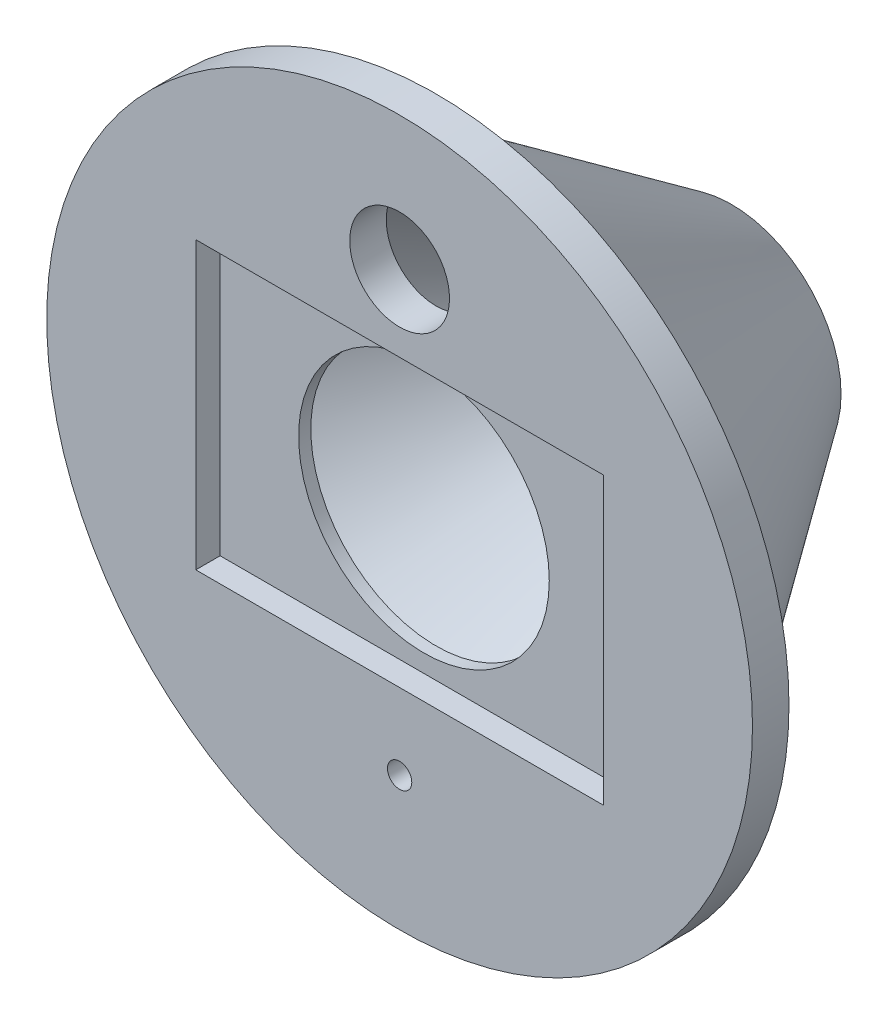
ISO-10303-21;
HEADER;
FILE_DESCRIPTION(('STEP AP214'),'2;1');
FILE_NAME('part.step','',(''),(''),'','','');
FILE_SCHEMA(('AUTOMOTIVE_DESIGN { 1 0 10303 214 1 1 1 1 }'));
ENDSEC;
DATA;
#1=APPLICATION_CONTEXT('core data for automotive mechanical design processes');
#2=APPLICATION_PROTOCOL_DEFINITION('international standard','automotive_design',2000,#1);
#3=PRODUCT_CONTEXT('',#1,'mechanical');
#4=PRODUCT('Part','Part','',(#3));
#5=PRODUCT_RELATED_PRODUCT_CATEGORY('part','',(#4));
#6=PRODUCT_DEFINITION_FORMATION('','',#4);
#7=PRODUCT_DEFINITION_CONTEXT('part definition',#1,'design');
#8=PRODUCT_DEFINITION('design','',#6,#7);
#9=PRODUCT_DEFINITION_SHAPE('','',#8);
#10=(LENGTH_UNIT() NAMED_UNIT(*) SI_UNIT(.MILLI.,.METRE.));
#11=(NAMED_UNIT(*) PLANE_ANGLE_UNIT() SI_UNIT($,.RADIAN.));
#12=(NAMED_UNIT(*) SI_UNIT($,.STERADIAN.) SOLID_ANGLE_UNIT());
#13=UNCERTAINTY_MEASURE_WITH_UNIT(LENGTH_MEASURE(1.E-05),#10,'distance_accuracy_value','');
#14=(GEOMETRIC_REPRESENTATION_CONTEXT(3) GLOBAL_UNCERTAINTY_ASSIGNED_CONTEXT((#13)) GLOBAL_UNIT_ASSIGNED_CONTEXT((#10,
#11,#12)) REPRESENTATION_CONTEXT('',''));
#15=CARTESIAN_POINT('',(0.,0.,0.));
#16=DIRECTION('',(0.,0.,1.));
#17=DIRECTION('',(1.,0.,0.));
#18=AXIS2_PLACEMENT_3D('',#15,#16,#17);
#19=CARTESIAN_POINT('',(0.,0.,0.));
#20=DIRECTION('',(0.,0.,1.));
#21=DIRECTION('',(1.,0.,0.));
#22=AXIS2_PLACEMENT_3D('',#19,#20,#21);
#23=CONICAL_SURFACE('',#22,9.,0.610865238198015);
#24=CARTESIAN_POINT('',(0.,0.,24.278516114616));
#25=DIRECTION('',(0.,0.,1.));
#26=DIRECTION('',(1.,0.,0.));
#27=AXIS2_PLACEMENT_3D('',#24,#25,#26);
#28=CIRCLE('',#27,26.);
#29=CARTESIAN_POINT('',(26.,0.,24.278516114616));
#30=VERTEX_POINT('',#29);
#31=EDGE_CURVE('E134',#30,#30,#28,.T.);
#32=ORIENTED_EDGE('',*,*,#31,.F.);
#33=EDGE_LOOP('',(#32));
#34=FACE_BOUND('',#33,.T.);
#35=CARTESIAN_POINT('',(0.,0.,0.));
#36=DIRECTION('',(0.,0.,1.));
#37=DIRECTION('',(1.,0.,0.));
#38=AXIS2_PLACEMENT_3D('',#35,#36,#37);
#39=CIRCLE('',#38,9.);
#40=CARTESIAN_POINT('',(9.,0.,0.));
#41=VERTEX_POINT('',#40);
#42=EDGE_CURVE('E127',#41,#41,#39,.T.);
#43=ORIENTED_EDGE('',*,*,#42,.T.);
#44=EDGE_LOOP('',(#43));
#45=FACE_BOUND('',#44,.T.);
#46=ADVANCED_FACE('F43',(#34,#45),#23,.T.);
#47=CARTESIAN_POINT('',(0.,0.,0.));
#48=DIRECTION('',(0.,0.,1.));
#49=DIRECTION('',(1.,0.,0.));
#50=AXIS2_PLACEMENT_3D('',#47,#48,#49);
#51=PLANE('',#50);
#52=CARTESIAN_POINT('',(0.,0.,0.));
#53=DIRECTION('',(0.,0.,1.));
#54=DIRECTION('',(1.,0.,0.));
#55=AXIS2_PLACEMENT_3D('',#52,#53,#54);
#56=CIRCLE('',#55,7.);
#57=CARTESIAN_POINT('',(7.,0.,0.));
#58=VERTEX_POINT('',#57);
#59=EDGE_CURVE('E123',#58,#58,#56,.T.);
#60=ORIENTED_EDGE('',*,*,#59,.T.);
#61=EDGE_LOOP('',(#60));
#62=FACE_BOUND('',#61,.T.);
#63=ORIENTED_EDGE('',*,*,#42,.F.);
#64=EDGE_LOOP('',(#63));
#65=FACE_BOUND('',#64,.T.);
#66=ADVANCED_FACE('F174',(#62,#65),#51,.F.);
#67=CARTESIAN_POINT('',(0.,0.,0.));
#68=DIRECTION('',(0.,0.,1.));
#69=DIRECTION('',(1.,0.,0.));
#70=AXIS2_PLACEMENT_3D('',#67,#68,#69);
#71=CONICAL_SURFACE('',#70,7.,0.610865238198015);
#72=CARTESIAN_POINT('',(0.,0.,24.278516114616));
#73=DIRECTION('',(0.,0.,1.));
#74=DIRECTION('',(1.,0.,0.));
#75=AXIS2_PLACEMENT_3D('',#72,#73,#74);
#76=CIRCLE('',#75,24.);
#77=CARTESIAN_POINT('',(24.,0.,24.278516114616));
#78=VERTEX_POINT('',#77);
#79=EDGE_CURVE('E117',#78,#78,#76,.T.);
#80=CARTESIAN_POINT('',(24.,0.,24.278516114616));
#81=CARTESIAN_POINT('',(23.8229166666667,0.,24.0256149050887));
#82=CARTESIAN_POINT('',(23.6458333333333,0.,23.7727136955614));
#83=CARTESIAN_POINT('',(23.2916666666667,0.,23.2669112765069));
#84=CARTESIAN_POINT('',(23.1145833333333,0.,23.0140100669797));
#85=CARTESIAN_POINT('',(22.7604166666667,0.,22.5082076479252));
#86=CARTESIAN_POINT('',(22.5833333333333,0.,22.255306438398));
#87=CARTESIAN_POINT('',(22.2291666666667,0.,21.7495040193435));
#88=CARTESIAN_POINT('',(22.0520833333333,0.,21.4966028098162));
#89=CARTESIAN_POINT('',(21.6979166666667,0.,20.9908003907617));
#90=CARTESIAN_POINT('',(21.5208333333333,0.,20.7378991812345));
#91=CARTESIAN_POINT('',(21.1666666666667,0.,20.23209676218));
#92=CARTESIAN_POINT('',(20.9895833333333,0.,19.9791955526527));
#93=CARTESIAN_POINT('',(20.6354166666667,0.,19.4733931335982));
#94=CARTESIAN_POINT('',(20.4583333333333,0.,19.220491924071));
#95=CARTESIAN_POINT('',(20.1041666666667,0.,18.7146895050165));
#96=CARTESIAN_POINT('',(19.9270833333333,0.,18.4617882954892));
#97=CARTESIAN_POINT('',(19.5729166666667,0.,17.9559858764347));
#98=CARTESIAN_POINT('',(19.3958333333333,0.,17.7030846669075));
#99=CARTESIAN_POINT('',(19.0416666666667,0.,17.197282247853));
#100=CARTESIAN_POINT('',(18.8645833333333,0.,16.9443810383257));
#101=CARTESIAN_POINT('',(18.5104166666667,0.,16.4385786192712));
#102=CARTESIAN_POINT('',(18.3333333333333,0.,16.185677409744));
#103=CARTESIAN_POINT('',(17.9791666666667,0.,15.6798749906895));
#104=CARTESIAN_POINT('',(17.8020833333333,0.,15.4269737811622));
#105=CARTESIAN_POINT('',(17.4479166666667,0.,14.9211713621077));
#106=CARTESIAN_POINT('',(17.2708333333333,0.,14.6682701525805));
#107=CARTESIAN_POINT('',(16.9166666666667,0.,14.162467733526));
#108=CARTESIAN_POINT('',(16.7395833333333,0.,13.9095665239987));
#109=CARTESIAN_POINT('',(16.3854166666667,0.,13.4037641049442));
#110=CARTESIAN_POINT('',(16.2083333333333,0.,13.150862895417));
#111=CARTESIAN_POINT('',(15.8541666666667,0.,12.6450604763625));
#112=CARTESIAN_POINT('',(15.6770833333333,0.,12.3921592668352));
#113=CARTESIAN_POINT('',(15.3229166666667,0.,11.8863568477807));
#114=CARTESIAN_POINT('',(15.1458333333333,0.,11.6334556382535));
#115=CARTESIAN_POINT('',(14.7916666666667,0.,11.127653219199));
#116=CARTESIAN_POINT('',(14.6145833333333,0.,10.8747520096717));
#117=CARTESIAN_POINT('',(14.2604166666667,0.,10.3689495906172));
#118=CARTESIAN_POINT('',(14.0833333333333,0.,10.11604838109));
#119=CARTESIAN_POINT('',(13.7291666666667,0.,9.61024596203548));
#120=CARTESIAN_POINT('',(13.5520833333333,0.,9.35734475250823));
#121=CARTESIAN_POINT('',(13.1979166666667,0.,8.85154233345373));
#122=CARTESIAN_POINT('',(13.0208333333333,0.,8.59864112392648));
#123=CARTESIAN_POINT('',(12.6666666666667,0.,8.09283870487198));
#124=CARTESIAN_POINT('',(12.4895833333333,0.,7.83993749534473));
#125=CARTESIAN_POINT('',(12.1354166666667,0.,7.33413507629023));
#126=CARTESIAN_POINT('',(11.9583333333333,0.,7.08123386676298));
#127=CARTESIAN_POINT('',(11.6041666666667,0.,6.57543144770849));
#128=CARTESIAN_POINT('',(11.4270833333333,0.,6.32253023818124));
#129=CARTESIAN_POINT('',(11.0729166666667,0.,5.81672781912674));
#130=CARTESIAN_POINT('',(10.8958333333333,0.,5.56382660959949));
#131=CARTESIAN_POINT('',(10.5416666666667,0.,5.05802419054499));
#132=CARTESIAN_POINT('',(10.3645833333333,0.,4.80512298101774));
#133=CARTESIAN_POINT('',(10.0104166666667,0.,4.29932056196324));
#134=CARTESIAN_POINT('',(9.83333333333333,0.,4.04641935243599));
#135=CARTESIAN_POINT('',(9.47916666666667,0.,3.54061693338149));
#136=CARTESIAN_POINT('',(9.30208333333333,0.,3.28771572385424));
#137=CARTESIAN_POINT('',(8.94791666666667,0.,2.78191330479974));
#138=CARTESIAN_POINT('',(8.77083333333333,0.,2.5290120952725));
#139=CARTESIAN_POINT('',(8.41666666666667,0.,2.023209676218));
#140=CARTESIAN_POINT('',(8.23958333333333,0.,1.77030846669075));
#141=CARTESIAN_POINT('',(7.88541666666667,0.,1.26450604763625));
#142=CARTESIAN_POINT('',(7.70833333333333,0.,1.011604838109));
#143=CARTESIAN_POINT('',(7.35416666666667,0.,0.505802419054499));
#144=CARTESIAN_POINT('',(7.17708333333333,0.,0.252901209527249));
#145=CARTESIAN_POINT('',(7.,0.,0.));
#146=B_SPLINE_CURVE_WITH_KNOTS('',3,(#80,#81,#82,#83,#84,#85,#86,#87,#88,#89,#90,#91,#92,#93,
#94,#95,#96,#97,#98,#99,#100,#101,#102,#103,#104,#105,#106,#107,#108,#109,#110,#111,#112,#113,
#114,#115,#116,#117,#118,#119,#120,#121,#122,#123,#124,#125,#126,#127,#128,#129,#130,#131,#132,
#133,#134,#135,#136,#137,#138,#139,#140,#141,#142,#143,#144,#145),.UNSPECIFIED.,.F.,.F.,(4,2,2,
2,2,2,2,2,2,2,2,2,2,2,2,2,2,2,2,2,2,2,2,2,2,2,2,2,2,2,2,2,4),(0.,0.926206110173709,
1.85241222034742,2.77861833052113,3.70482444069484,4.63103055086854,5.55723666104225,
6.48344277121596,7.40964888138967,8.33585499156338,9.26206110173709,10.1882672119108,
11.1144733220845,12.0406794322582,12.9668855424319,13.8930916526056,14.8192977627793,
15.745503872953,16.6717099831268,17.5979160933005,18.5241222034742,19.4503283136479,
20.3765344238216,21.3027405339953,22.228946644169,23.1551527543427,24.0813588645164,
25.0075649746901,25.9337710848638,26.8599771950376,27.7861833052113,28.712389415385,
29.6385955255587),.UNSPECIFIED.);
#147=EDGE_CURVE('BSEAM176',#78,#58,#146,.T.);
#148=ORIENTED_EDGE('',*,*,#79,.T.);
#149=ORIENTED_EDGE('',*,*,#59,.F.);
#150=ORIENTED_EDGE('',*,*,#147,.T.);
#151=ORIENTED_EDGE('',*,*,#147,.F.);
#152=EDGE_LOOP('',(#148,#150,#149,#151));
#153=FACE_BOUND('',#152,.T.);
#154=ADVANCED_FACE('F176',(#153),#71,.F.);
#155=CARTESIAN_POINT('',(0.,0.,24.278516114616));
#156=DIRECTION('',(0.,0.,1.));
#157=DIRECTION('',(1.,0.,0.));
#158=AXIS2_PLACEMENT_3D('',#155,#156,#157);
#159=PLANE('',#158);
#160=ORIENTED_EDGE('',*,*,#31,.T.);
#161=EDGE_LOOP('',(#160));
#162=FACE_BOUND('',#161,.T.);
#163=CARTESIAN_POINT('',(0.,0.,24.278516114616));
#164=DIRECTION('',(0.,0.,1.));
#165=DIRECTION('',(1.,0.,0.));
#166=AXIS2_PLACEMENT_3D('',#163,#164,#165);
#167=CIRCLE('',#166,29.);
#168=CARTESIAN_POINT('',(29.,0.,24.278516114616));
#169=VERTEX_POINT('',#168);
#170=EDGE_CURVE('E114',#169,#169,#167,.T.);
#171=ORIENTED_EDGE('',*,*,#170,.F.);
#172=EDGE_LOOP('',(#171));
#173=FACE_BOUND('',#172,.T.);
#174=ADVANCED_FACE('F181',(#162,#173),#159,.F.);
#175=CARTESIAN_POINT('',(0.,0.,27.278516114616));
#176=DIRECTION('',(0.,0.,1.));
#177=DIRECTION('',(1.,0.,0.));
#178=AXIS2_PLACEMENT_3D('',#175,#176,#177);
#179=PLANE('',#178);
#180=CARTESIAN_POINT('',(0.,-18.,27.278516114616));
#181=DIRECTION('',(0.,0.,1.));
#182=DIRECTION('',(1.,0.,0.));
#183=AXIS2_PLACEMENT_3D('',#180,#181,#182);
#184=CIRCLE('',#183,1.);
#185=CARTESIAN_POINT('',(1.,-18.,27.2785161146159));
#186=VERTEX_POINT('',#185);
#187=EDGE_CURVE('E103',#186,#186,#184,.T.);
#188=ORIENTED_EDGE('',*,*,#187,.F.);
#189=EDGE_LOOP('',(#188));
#190=FACE_BOUND('',#189,.T.);
#191=CARTESIAN_POINT('',(0.,18.,27.278516114616));
#192=DIRECTION('',(0.,0.,1.));
#193=DIRECTION('',(1.,0.,0.));
#194=AXIS2_PLACEMENT_3D('',#191,#192,#193);
#195=CIRCLE('',#194,4.1);
#196=CARTESIAN_POINT('',(4.1,18.,27.2785161146159));
#197=VERTEX_POINT('',#196);
#198=EDGE_CURVE('E145',#197,#197,#195,.T.);
#199=ORIENTED_EDGE('',*,*,#198,.F.);
#200=EDGE_LOOP('',(#199));
#201=FACE_BOUND('',#200,.T.);
#202=DIRECTION('',(0.,-1.,0.));
#203=VECTOR('',#202,1.);
#204=CARTESIAN_POINT('',(-16.75,0.,27.278516114616));
#205=LINE('',#204,#203);
#206=CARTESIAN_POINT('',(-16.75,11.75,27.278516114616));
#207=VERTEX_POINT('',#206);
#208=CARTESIAN_POINT('',(-16.75,-11.75,27.278516114616));
#209=VERTEX_POINT('',#208);
#210=EDGE_CURVE('E11',#207,#209,#205,.T.);
#211=ORIENTED_EDGE('',*,*,#210,.F.);
#212=DIRECTION('',(-1.,0.,0.));
#213=VECTOR('',#212,1.);
#214=CARTESIAN_POINT('',(0.,11.75,27.278516114616));
#215=LINE('',#214,#213);
#216=CARTESIAN_POINT('',(16.75,11.75,27.278516114616));
#217=VERTEX_POINT('',#216);
#218=EDGE_CURVE('E51',#217,#207,#215,.T.);
#219=ORIENTED_EDGE('',*,*,#218,.F.);
#220=DIRECTION('',(0.,1.,0.));
#221=VECTOR('',#220,1.);
#222=CARTESIAN_POINT('',(16.75,0.,27.278516114616));
#223=LINE('',#222,#221);
#224=CARTESIAN_POINT('',(16.75,-11.75,27.278516114616));
#225=VERTEX_POINT('',#224);
#226=EDGE_CURVE('E136',#225,#217,#223,.T.);
#227=ORIENTED_EDGE('',*,*,#226,.F.);
#228=DIRECTION('',(1.,0.,0.));
#229=VECTOR('',#228,1.);
#230=CARTESIAN_POINT('',(0.,-11.75,27.278516114616));
#231=LINE('',#230,#229);
#232=EDGE_CURVE('E133',#209,#225,#231,.T.);
#233=ORIENTED_EDGE('',*,*,#232,.F.);
#234=EDGE_LOOP('',(#211,#219,#227,#233));
#235=FACE_BOUND('',#234,.T.);
#236=CARTESIAN_POINT('',(0.,0.,27.278516114616));
#237=DIRECTION('',(0.,0.,1.));
#238=DIRECTION('',(1.,0.,0.));
#239=AXIS2_PLACEMENT_3D('',#236,#237,#238);
#240=CIRCLE('',#239,29.);
#241=CARTESIAN_POINT('',(29.,0.,27.278516114616));
#242=VERTEX_POINT('',#241);
#243=EDGE_CURVE('E116',#242,#242,#240,.T.);
#244=ORIENTED_EDGE('',*,*,#243,.T.);
#245=EDGE_LOOP('',(#244));
#246=FACE_BOUND('',#245,.T.);
#247=ADVANCED_FACE('F189',(#190,#201,#235,#246),#179,.T.);
#248=CARTESIAN_POINT('',(0.,0.,27.278516114616));
#249=DIRECTION('',(0.,0.,-1.));
#250=DIRECTION('',(-1.,0.,0.));
#251=AXIS2_PLACEMENT_3D('',#248,#249,#250);
#252=CYLINDRICAL_SURFACE('',#251,29.);
#253=ORIENTED_EDGE('',*,*,#243,.F.);
#254=EDGE_LOOP('',(#253));
#255=FACE_BOUND('',#254,.T.);
#256=ORIENTED_EDGE('',*,*,#170,.T.);
#257=EDGE_LOOP('',(#256));
#258=FACE_BOUND('',#257,.T.);
#259=ADVANCED_FACE('F187',(#255,#258),#252,.T.);
#260=CARTESIAN_POINT('',(0.,-18.,24.278516114616));
#261=DIRECTION('',(0.,0.,1.));
#262=DIRECTION('',(1.,0.,0.));
#263=AXIS2_PLACEMENT_3D('',#260,#261,#262);
#264=CIRCLE('',#263,1.);
#265=CARTESIAN_POINT('',(1.,-18.,24.278516114616));
#266=VERTEX_POINT('',#265);
#267=EDGE_CURVE('E46',#266,#266,#264,.T.);
#268=ORIENTED_EDGE('',*,*,#267,.T.);
#269=EDGE_LOOP('',(#268));
#270=FACE_BOUND('',#269,.T.);
#271=CARTESIAN_POINT('',(0.,18.,24.278516114616));
#272=DIRECTION('',(0.,0.,1.));
#273=DIRECTION('',(1.,0.,0.));
#274=AXIS2_PLACEMENT_3D('',#271,#272,#273);
#275=CIRCLE('',#274,4.1);
#276=CARTESIAN_POINT('',(4.1,18.,24.278516114616));
#277=VERTEX_POINT('',#276);
#278=EDGE_CURVE('E142',#277,#277,#275,.T.);
#279=ORIENTED_EDGE('',*,*,#278,.T.);
#280=EDGE_LOOP('',(#279));
#281=FACE_BOUND('',#280,.T.);
#282=CARTESIAN_POINT('',(0.,0.,24.278516114616));
#283=DIRECTION('',(0.,0.,1.));
#284=DIRECTION('',(1.,0.,0.));
#285=AXIS2_PLACEMENT_3D('',#282,#283,#284);
#286=CIRCLE('',#285,10.3);
#287=CARTESIAN_POINT('',(10.3,0.,24.278516114616));
#288=VERTEX_POINT('',#287);
#289=EDGE_CURVE('E143',#288,#288,#286,.T.);
#290=ORIENTED_EDGE('',*,*,#289,.T.);
#291=EDGE_LOOP('',(#290));
#292=FACE_BOUND('',#291,.T.);
#293=ORIENTED_EDGE('',*,*,#79,.F.);
#294=EDGE_LOOP('',(#293));
#295=FACE_BOUND('',#294,.T.);
#296=ADVANCED_FACE('F155',(#270,#281,#292,#295),#159,.F.);
#297=CARTESIAN_POINT('',(-16.75,11.75,25.278516114616));
#298=DIRECTION('',(-1.,0.,0.));
#299=DIRECTION('',(0.,0.,1.));
#300=AXIS2_PLACEMENT_3D('',#297,#298,#299);
#301=PLANE('',#300);
#302=ORIENTED_EDGE('',*,*,#210,.T.);
#303=DIRECTION('',(0.,0.,1.));
#304=VECTOR('',#303,1.);
#305=CARTESIAN_POINT('',(-16.75,-11.75,25.278516114616));
#306=LINE('',#305,#304);
#307=CARTESIAN_POINT('',(-16.75,-11.75,25.278516114616));
#308=VERTEX_POINT('',#307);
#309=EDGE_CURVE('E56',#308,#209,#306,.T.);
#310=ORIENTED_EDGE('',*,*,#309,.F.);
#311=DIRECTION('',(0.,-1.,0.));
#312=VECTOR('',#311,1.);
#313=CARTESIAN_POINT('',(-16.75,11.75,25.278516114616));
#314=LINE('',#313,#312);
#315=CARTESIAN_POINT('',(-16.75,11.75,25.278516114616));
#316=VERTEX_POINT('',#315);
#317=EDGE_CURVE('E84',#316,#308,#314,.T.);
#318=ORIENTED_EDGE('',*,*,#317,.F.);
#319=DIRECTION('',(0.,0.,1.));
#320=VECTOR('',#319,1.);
#321=CARTESIAN_POINT('',(-16.75,11.75,25.278516114616));
#322=LINE('',#321,#320);
#323=EDGE_CURVE('E112',#316,#207,#322,.T.);
#324=ORIENTED_EDGE('',*,*,#323,.T.);
#325=EDGE_LOOP('',(#302,#310,#318,#324));
#326=FACE_BOUND('',#325,.T.);
#327=ADVANCED_FACE('F83',(#326),#301,.F.);
#328=CARTESIAN_POINT('',(16.75,11.75,25.278516114616));
#329=DIRECTION('',(0.,1.,0.));
#330=DIRECTION('',(0.,0.,1.));
#331=AXIS2_PLACEMENT_3D('',#328,#329,#330);
#332=PLANE('',#331);
#333=ORIENTED_EDGE('',*,*,#218,.T.);
#334=ORIENTED_EDGE('',*,*,#323,.F.);
#335=DIRECTION('',(-1.,0.,0.));
#336=VECTOR('',#335,1.);
#337=CARTESIAN_POINT('',(16.75,11.75,25.278516114616));
#338=LINE('',#337,#336);
#339=CARTESIAN_POINT('',(16.75,11.75,25.278516114616));
#340=VERTEX_POINT('',#339);
#341=EDGE_CURVE('E89',#340,#316,#338,.T.);
#342=ORIENTED_EDGE('',*,*,#341,.F.);
#343=DIRECTION('',(0.,0.,1.));
#344=VECTOR('',#343,1.);
#345=CARTESIAN_POINT('',(16.75,11.75,25.278516114616));
#346=LINE('',#345,#344);
#347=EDGE_CURVE('E111',#340,#217,#346,.T.);
#348=ORIENTED_EDGE('',*,*,#347,.T.);
#349=EDGE_LOOP('',(#333,#334,#342,#348));
#350=FACE_BOUND('',#349,.T.);
#351=ADVANCED_FACE('F243',(#350),#332,.F.);
#352=CARTESIAN_POINT('',(16.75,-11.75,25.278516114616));
#353=DIRECTION('',(1.,0.,0.));
#354=DIRECTION('',(0.,0.,-1.));
#355=AXIS2_PLACEMENT_3D('',#352,#353,#354);
#356=PLANE('',#355);
#357=ORIENTED_EDGE('',*,*,#226,.T.);
#358=ORIENTED_EDGE('',*,*,#347,.F.);
#359=DIRECTION('',(0.,1.,0.));
#360=VECTOR('',#359,1.);
#361=CARTESIAN_POINT('',(16.75,-11.75,25.278516114616));
#362=LINE('',#361,#360);
#363=CARTESIAN_POINT('',(16.75,-11.75,25.278516114616));
#364=VERTEX_POINT('',#363);
#365=EDGE_CURVE('E97',#364,#340,#362,.T.);
#366=ORIENTED_EDGE('',*,*,#365,.F.);
#367=DIRECTION('',(0.,0.,1.));
#368=VECTOR('',#367,1.);
#369=CARTESIAN_POINT('',(16.75,-11.75,25.278516114616));
#370=LINE('',#369,#368);
#371=EDGE_CURVE('E90',#364,#225,#370,.T.);
#372=ORIENTED_EDGE('',*,*,#371,.T.);
#373=EDGE_LOOP('',(#357,#358,#366,#372));
#374=FACE_BOUND('',#373,.T.);
#375=ADVANCED_FACE('F251',(#374),#356,.F.);
#376=CARTESIAN_POINT('',(-16.75,-11.75,25.278516114616));
#377=DIRECTION('',(0.,-1.,0.));
#378=DIRECTION('',(0.,0.,-1.));
#379=AXIS2_PLACEMENT_3D('',#376,#377,#378);
#380=PLANE('',#379);
#381=ORIENTED_EDGE('',*,*,#232,.T.);
#382=ORIENTED_EDGE('',*,*,#371,.F.);
#383=DIRECTION('',(1.,0.,0.));
#384=VECTOR('',#383,1.);
#385=CARTESIAN_POINT('',(-16.75,-11.75,25.278516114616));
#386=LINE('',#385,#384);
#387=EDGE_CURVE('E91',#308,#364,#386,.T.);
#388=ORIENTED_EDGE('',*,*,#387,.F.);
#389=ORIENTED_EDGE('',*,*,#309,.T.);
#390=EDGE_LOOP('',(#381,#382,#388,#389));
#391=FACE_BOUND('',#390,.T.);
#392=ADVANCED_FACE('F94',(#391),#380,.F.);
#393=CARTESIAN_POINT('',(0.,0.,25.278516114616));
#394=DIRECTION('',(0.,0.,1.));
#395=DIRECTION('',(1.,0.,0.));
#396=AXIS2_PLACEMENT_3D('',#393,#394,#395);
#397=PLANE('',#396);
#398=CARTESIAN_POINT('',(0.,0.,25.278516114616));
#399=DIRECTION('',(0.,0.,1.));
#400=DIRECTION('',(1.,0.,0.));
#401=AXIS2_PLACEMENT_3D('',#398,#399,#400);
#402=CIRCLE('',#401,10.3);
#403=CARTESIAN_POINT('',(10.3,0.,25.278516114616));
#404=VERTEX_POINT('',#403);
#405=EDGE_CURVE('E137',#404,#404,#402,.T.);
#406=ORIENTED_EDGE('',*,*,#405,.F.);
#407=EDGE_LOOP('',(#406));
#408=FACE_BOUND('',#407,.T.);
#409=ORIENTED_EDGE('',*,*,#317,.T.);
#410=ORIENTED_EDGE('',*,*,#387,.T.);
#411=ORIENTED_EDGE('',*,*,#365,.T.);
#412=ORIENTED_EDGE('',*,*,#341,.T.);
#413=EDGE_LOOP('',(#409,#410,#411,#412));
#414=FACE_BOUND('',#413,.T.);
#415=ADVANCED_FACE('F101',(#408,#414),#397,.T.);
#416=CARTESIAN_POINT('',(0.,0.,23.9785161146159));
#417=DIRECTION('',(0.,0.,1.));
#418=DIRECTION('',(1.,0.,0.));
#419=AXIS2_PLACEMENT_3D('',#416,#417,#418);
#420=CYLINDRICAL_SURFACE('',#419,10.3);
#421=CARTESIAN_POINT('',(10.3,0.,25.278516114616));
#422=CARTESIAN_POINT('',(10.3,0.,25.2680994479493));
#423=CARTESIAN_POINT('',(10.3,0.,25.2576827812826));
#424=CARTESIAN_POINT('',(10.3,0.,25.2368494479493));
#425=CARTESIAN_POINT('',(10.3,0.,25.2264327812826));
#426=CARTESIAN_POINT('',(10.3,0.,25.2055994479493));
#427=CARTESIAN_POINT('',(10.3,0.,25.1951827812826));
#428=CARTESIAN_POINT('',(10.3,0.,25.1743494479493));
#429=CARTESIAN_POINT('',(10.3,0.,25.1639327812826));
#430=CARTESIAN_POINT('',(10.3,0.,25.1430994479493));
#431=CARTESIAN_POINT('',(10.3,0.,25.1326827812826));
#432=CARTESIAN_POINT('',(10.3,0.,25.1118494479493));
#433=CARTESIAN_POINT('',(10.3,0.,25.1014327812826));
#434=CARTESIAN_POINT('',(10.3,0.,25.0805994479493));
#435=CARTESIAN_POINT('',(10.3,0.,25.0701827812826));
#436=CARTESIAN_POINT('',(10.3,0.,25.0493494479493));
#437=CARTESIAN_POINT('',(10.3,0.,25.0389327812826));
#438=CARTESIAN_POINT('',(10.3,0.,25.0180994479493));
#439=CARTESIAN_POINT('',(10.3,0.,25.0076827812826));
#440=CARTESIAN_POINT('',(10.3,0.,24.9868494479493));
#441=CARTESIAN_POINT('',(10.3,0.,24.9764327812826));
#442=CARTESIAN_POINT('',(10.3,0.,24.9555994479493));
#443=CARTESIAN_POINT('',(10.3,0.,24.9451827812826));
#444=CARTESIAN_POINT('',(10.3,0.,24.9243494479493));
#445=CARTESIAN_POINT('',(10.3,0.,24.9139327812826));
#446=CARTESIAN_POINT('',(10.3,0.,24.8930994479493));
#447=CARTESIAN_POINT('',(10.3,0.,24.8826827812826));
#448=CARTESIAN_POINT('',(10.3,0.,24.8618494479493));
#449=CARTESIAN_POINT('',(10.3,0.,24.8514327812826));
#450=CARTESIAN_POINT('',(10.3,0.,24.8305994479493));
#451=CARTESIAN_POINT('',(10.3,0.,24.8201827812826));
#452=CARTESIAN_POINT('',(10.3,0.,24.7993494479493));
#453=CARTESIAN_POINT('',(10.3,0.,24.7889327812826));
#454=CARTESIAN_POINT('',(10.3,0.,24.7680994479493));
#455=CARTESIAN_POINT('',(10.3,0.,24.7576827812826));
#456=CARTESIAN_POINT('',(10.3,0.,24.7368494479493));
#457=CARTESIAN_POINT('',(10.3,0.,24.7264327812826));
#458=CARTESIAN_POINT('',(10.3,0.,24.7055994479493));
#459=CARTESIAN_POINT('',(10.3,0.,24.6951827812826));
#460=CARTESIAN_POINT('',(10.3,0.,24.6743494479493));
#461=CARTESIAN_POINT('',(10.3,0.,24.6639327812826));
#462=CARTESIAN_POINT('',(10.3,0.,24.6430994479493));
#463=CARTESIAN_POINT('',(10.3,0.,24.6326827812826));
#464=CARTESIAN_POINT('',(10.3,0.,24.6118494479493));
#465=CARTESIAN_POINT('',(10.3,0.,24.6014327812826));
#466=CARTESIAN_POINT('',(10.3,0.,24.5805994479493));
#467=CARTESIAN_POINT('',(10.3,0.,24.5701827812826));
#468=CARTESIAN_POINT('',(10.3,0.,24.5493494479493));
#469=CARTESIAN_POINT('',(10.3,0.,24.5389327812826));
#470=CARTESIAN_POINT('',(10.3,0.,24.5180994479493));
#471=CARTESIAN_POINT('',(10.3,0.,24.5076827812826));
#472=CARTESIAN_POINT('',(10.3,0.,24.4868494479493));
#473=CARTESIAN_POINT('',(10.3,0.,24.4764327812826));
#474=CARTESIAN_POINT('',(10.3,0.,24.4555994479493));
#475=CARTESIAN_POINT('',(10.3,0.,24.4451827812826));
#476=CARTESIAN_POINT('',(10.3,0.,24.4243494479493));
#477=CARTESIAN_POINT('',(10.3,0.,24.4139327812826));
#478=CARTESIAN_POINT('',(10.3,0.,24.3930994479493));
#479=CARTESIAN_POINT('',(10.3,0.,24.3826827812826));
#480=CARTESIAN_POINT('',(10.3,0.,24.3618494479493));
#481=CARTESIAN_POINT('',(10.3,0.,24.3514327812826));
#482=CARTESIAN_POINT('',(10.3,0.,24.3305994479493));
#483=CARTESIAN_POINT('',(10.3,0.,24.3201827812826));
#484=CARTESIAN_POINT('',(10.3,0.,24.2993494479493));
#485=CARTESIAN_POINT('',(10.3,0.,24.2889327812826));
#486=CARTESIAN_POINT('',(10.3,0.,24.278516114616));
#487=B_SPLINE_CURVE_WITH_KNOTS('',3,(#421,#422,#423,#424,#425,#426,#427,#428,#429,#430,#431,
#432,#433,#434,#435,#436,#437,#438,#439,#440,#441,#442,#443,#444,#445,#446,#447,#448,#449,#450,
#451,#452,#453,#454,#455,#456,#457,#458,#459,#460,#461,#462,#463,#464,#465,#466,#467,#468,#469,
#470,#471,#472,#473,#474,#475,#476,#477,#478,#479,#480,#481,#482,#483,#484,#485,#486),
.UNSPECIFIED.,.F.,.F.,(4,2,2,2,2,2,2,2,2,2,2,2,2,2,2,2,2,2,2,2,2,2,2,2,2,2,2,2,2,2,2,2,4),(0.,
0.03125,0.0625000000000001,0.0937500000000001,0.125,0.15625,0.1875,0.21875,0.25,0.28125,0.3125,
0.34375,0.375,0.40625,0.4375,0.46875,0.5,0.53125,0.5625,0.593750000000001,0.625000000000001,
0.656250000000001,0.687500000000004,0.718750000000001,0.750000000000004,0.781250000000001,
0.812500000000001,0.843750000000001,0.875000000000004,0.906250000000004,0.937500000000004,
0.968750000000004,1.),.UNSPECIFIED.);
#488=EDGE_CURVE('BSEAM154',#404,#288,#487,.T.);
#489=ORIENTED_EDGE('',*,*,#405,.T.);
#490=ORIENTED_EDGE('',*,*,#289,.F.);
#491=ORIENTED_EDGE('',*,*,#488,.T.);
#492=ORIENTED_EDGE('',*,*,#488,.F.);
#493=EDGE_LOOP('',(#489,#491,#490,#492));
#494=FACE_BOUND('',#493,.T.);
#495=ADVANCED_FACE('F154',(#494),#420,.F.);
#496=CARTESIAN_POINT('',(0.,18.,23.9785161146159));
#497=DIRECTION('',(0.,0.,1.));
#498=DIRECTION('',(1.,0.,0.));
#499=AXIS2_PLACEMENT_3D('',#496,#497,#498);
#500=CYLINDRICAL_SURFACE('',#499,4.1);
#501=CARTESIAN_POINT('',(4.1,18.,27.2785161146159));
#502=CARTESIAN_POINT('',(4.1,18.,27.2472661146159));
#503=CARTESIAN_POINT('',(4.1,18.,27.2160161146159));
#504=CARTESIAN_POINT('',(4.1,18.,27.1535161146159));
#505=CARTESIAN_POINT('',(4.1,18.,27.1222661146159));
#506=CARTESIAN_POINT('',(4.1,18.,27.0597661146159));
#507=CARTESIAN_POINT('',(4.1,18.,27.0285161146159));
#508=CARTESIAN_POINT('',(4.1,18.,26.9660161146159));
#509=CARTESIAN_POINT('',(4.1,18.,26.934766114616));
#510=CARTESIAN_POINT('',(4.1,18.,26.872266114616));
#511=CARTESIAN_POINT('',(4.1,18.,26.8410161146159));
#512=CARTESIAN_POINT('',(4.1,18.,26.7785161146159));
#513=CARTESIAN_POINT('',(4.1,18.,26.747266114616));
#514=CARTESIAN_POINT('',(4.1,18.,26.684766114616));
#515=CARTESIAN_POINT('',(4.1,18.,26.653516114616));
#516=CARTESIAN_POINT('',(4.1,18.,26.591016114616));
#517=CARTESIAN_POINT('',(4.1,18.,26.559766114616));
#518=CARTESIAN_POINT('',(4.1,18.,26.497266114616));
#519=CARTESIAN_POINT('',(4.1,18.,26.466016114616));
#520=CARTESIAN_POINT('',(4.1,18.,26.403516114616));
#521=CARTESIAN_POINT('',(4.1,18.,26.372266114616));
#522=CARTESIAN_POINT('',(4.1,18.,26.309766114616));
#523=CARTESIAN_POINT('',(4.1,18.,26.278516114616));
#524=CARTESIAN_POINT('',(4.1,18.,26.216016114616));
#525=CARTESIAN_POINT('',(4.1,18.,26.184766114616));
#526=CARTESIAN_POINT('',(4.1,18.,26.122266114616));
#527=CARTESIAN_POINT('',(4.1,18.,26.091016114616));
#528=CARTESIAN_POINT('',(4.1,18.,26.028516114616));
#529=CARTESIAN_POINT('',(4.1,18.,25.997266114616));
#530=CARTESIAN_POINT('',(4.1,18.,25.934766114616));
#531=CARTESIAN_POINT('',(4.1,18.,25.903516114616));
#532=CARTESIAN_POINT('',(4.1,18.,25.841016114616));
#533=CARTESIAN_POINT('',(4.1,18.,25.809766114616));
#534=CARTESIAN_POINT('',(4.1,18.,25.747266114616));
#535=CARTESIAN_POINT('',(4.1,18.,25.716016114616));
#536=CARTESIAN_POINT('',(4.1,18.,25.653516114616));
#537=CARTESIAN_POINT('',(4.1,18.,25.622266114616));
#538=CARTESIAN_POINT('',(4.1,18.,25.559766114616));
#539=CARTESIAN_POINT('',(4.1,18.,25.528516114616));
#540=CARTESIAN_POINT('',(4.1,18.,25.466016114616));
#541=CARTESIAN_POINT('',(4.1,18.,25.434766114616));
#542=CARTESIAN_POINT('',(4.1,18.,25.372266114616));
#543=CARTESIAN_POINT('',(4.1,18.,25.341016114616));
#544=CARTESIAN_POINT('',(4.1,18.,25.278516114616));
#545=CARTESIAN_POINT('',(4.1,18.,25.247266114616));
#546=CARTESIAN_POINT('',(4.1,18.,25.184766114616));
#547=CARTESIAN_POINT('',(4.1,18.,25.153516114616));
#548=CARTESIAN_POINT('',(4.1,18.,25.091016114616));
#549=CARTESIAN_POINT('',(4.1,18.,25.059766114616));
#550=CARTESIAN_POINT('',(4.1,18.,24.997266114616));
#551=CARTESIAN_POINT('',(4.1,18.,24.966016114616));
#552=CARTESIAN_POINT('',(4.1,18.,24.903516114616));
#553=CARTESIAN_POINT('',(4.1,18.,24.872266114616));
#554=CARTESIAN_POINT('',(4.1,18.,24.809766114616));
#555=CARTESIAN_POINT('',(4.1,18.,24.778516114616));
#556=CARTESIAN_POINT('',(4.1,18.,24.716016114616));
#557=CARTESIAN_POINT('',(4.1,18.,24.684766114616));
#558=CARTESIAN_POINT('',(4.1,18.,24.622266114616));
#559=CARTESIAN_POINT('',(4.1,18.,24.591016114616));
#560=CARTESIAN_POINT('',(4.1,18.,24.528516114616));
#561=CARTESIAN_POINT('',(4.1,18.,24.497266114616));
#562=CARTESIAN_POINT('',(4.1,18.,24.434766114616));
#563=CARTESIAN_POINT('',(4.1,18.,24.403516114616));
#564=CARTESIAN_POINT('',(4.1,18.,24.341016114616));
#565=CARTESIAN_POINT('',(4.1,18.,24.309766114616));
#566=CARTESIAN_POINT('',(4.1,18.,24.278516114616));
#567=B_SPLINE_CURVE_WITH_KNOTS('',3,(#501,#502,#503,#504,#505,#506,#507,#508,#509,#510,#511,
#512,#513,#514,#515,#516,#517,#518,#519,#520,#521,#522,#523,#524,#525,#526,#527,#528,#529,#530,
#531,#532,#533,#534,#535,#536,#537,#538,#539,#540,#541,#542,#543,#544,#545,#546,#547,#548,#549,
#550,#551,#552,#553,#554,#555,#556,#557,#558,#559,#560,#561,#562,#563,#564,#565,#566),
.UNSPECIFIED.,.F.,.F.,(4,2,2,2,2,2,2,2,2,2,2,2,2,2,2,2,2,2,2,2,2,2,2,2,2,2,2,2,2,2,2,2,4),(0.,
0.0937500000000001,0.1875,0.28125,0.374999999999997,0.46875,0.562499999999997,0.656249999999997,
0.749999999999997,0.843749999999997,0.937499999999997,1.03125,1.125,1.21875,1.3125,1.40625,1.5,
1.59375,1.6875,1.78125,1.875,1.96875,2.0625,2.15625,2.25,2.34375,2.4375,2.53125,2.625,2.71875,
2.8125,2.90625,3.),.UNSPECIFIED.);
#568=EDGE_CURVE('BSEAM160',#197,#277,#567,.T.);
#569=ORIENTED_EDGE('',*,*,#198,.T.);
#570=ORIENTED_EDGE('',*,*,#278,.F.);
#571=ORIENTED_EDGE('',*,*,#568,.T.);
#572=ORIENTED_EDGE('',*,*,#568,.F.);
#573=EDGE_LOOP('',(#569,#571,#570,#572));
#574=FACE_BOUND('',#573,.T.);
#575=ADVANCED_FACE('F160',(#574),#500,.F.);
#576=CARTESIAN_POINT('',(0.,-18.,23.9785161146159));
#577=DIRECTION('',(0.,0.,1.));
#578=DIRECTION('',(1.,0.,0.));
#579=AXIS2_PLACEMENT_3D('',#576,#577,#578);
#580=CYLINDRICAL_SURFACE('',#579,1.);
#581=CARTESIAN_POINT('',(1.,-18.,27.2785161146159));
#582=CARTESIAN_POINT('',(1.,-18.,27.2472661146159));
#583=CARTESIAN_POINT('',(1.,-18.,27.2160161146159));
#584=CARTESIAN_POINT('',(1.,-18.,27.1535161146159));
#585=CARTESIAN_POINT('',(1.,-18.,27.1222661146159));
#586=CARTESIAN_POINT('',(1.,-18.,27.0597661146159));
#587=CARTESIAN_POINT('',(1.,-18.,27.0285161146159));
#588=CARTESIAN_POINT('',(1.,-18.,26.9660161146159));
#589=CARTESIAN_POINT('',(1.,-18.,26.934766114616));
#590=CARTESIAN_POINT('',(1.,-18.,26.872266114616));
#591=CARTESIAN_POINT('',(1.,-18.,26.8410161146159));
#592=CARTESIAN_POINT('',(1.,-18.,26.7785161146159));
#593=CARTESIAN_POINT('',(1.,-18.,26.747266114616));
#594=CARTESIAN_POINT('',(1.,-18.,26.684766114616));
#595=CARTESIAN_POINT('',(1.,-18.,26.653516114616));
#596=CARTESIAN_POINT('',(1.,-18.,26.591016114616));
#597=CARTESIAN_POINT('',(1.,-18.,26.559766114616));
#598=CARTESIAN_POINT('',(1.,-18.,26.497266114616));
#599=CARTESIAN_POINT('',(1.,-18.,26.466016114616));
#600=CARTESIAN_POINT('',(1.,-18.,26.403516114616));
#601=CARTESIAN_POINT('',(1.,-18.,26.372266114616));
#602=CARTESIAN_POINT('',(1.,-18.,26.309766114616));
#603=CARTESIAN_POINT('',(1.,-18.,26.278516114616));
#604=CARTESIAN_POINT('',(1.,-18.,26.216016114616));
#605=CARTESIAN_POINT('',(1.,-18.,26.184766114616));
#606=CARTESIAN_POINT('',(1.,-18.,26.122266114616));
#607=CARTESIAN_POINT('',(1.,-18.,26.091016114616));
#608=CARTESIAN_POINT('',(1.,-18.,26.028516114616));
#609=CARTESIAN_POINT('',(1.,-18.,25.997266114616));
#610=CARTESIAN_POINT('',(1.,-18.,25.934766114616));
#611=CARTESIAN_POINT('',(1.,-18.,25.903516114616));
#612=CARTESIAN_POINT('',(1.,-18.,25.841016114616));
#613=CARTESIAN_POINT('',(1.,-18.,25.809766114616));
#614=CARTESIAN_POINT('',(1.,-18.,25.747266114616));
#615=CARTESIAN_POINT('',(1.,-18.,25.716016114616));
#616=CARTESIAN_POINT('',(1.,-18.,25.653516114616));
#617=CARTESIAN_POINT('',(1.,-18.,25.622266114616));
#618=CARTESIAN_POINT('',(1.,-18.,25.559766114616));
#619=CARTESIAN_POINT('',(1.,-18.,25.528516114616));
#620=CARTESIAN_POINT('',(1.,-18.,25.466016114616));
#621=CARTESIAN_POINT('',(1.,-18.,25.434766114616));
#622=CARTESIAN_POINT('',(1.,-18.,25.372266114616));
#623=CARTESIAN_POINT('',(1.,-18.,25.341016114616));
#624=CARTESIAN_POINT('',(1.,-18.,25.278516114616));
#625=CARTESIAN_POINT('',(1.,-18.,25.247266114616));
#626=CARTESIAN_POINT('',(1.,-18.,25.184766114616));
#627=CARTESIAN_POINT('',(1.,-18.,25.153516114616));
#628=CARTESIAN_POINT('',(1.,-18.,25.091016114616));
#629=CARTESIAN_POINT('',(1.,-18.,25.059766114616));
#630=CARTESIAN_POINT('',(1.,-18.,24.997266114616));
#631=CARTESIAN_POINT('',(1.,-18.,24.966016114616));
#632=CARTESIAN_POINT('',(1.,-18.,24.903516114616));
#633=CARTESIAN_POINT('',(1.,-18.,24.872266114616));
#634=CARTESIAN_POINT('',(1.,-18.,24.809766114616));
#635=CARTESIAN_POINT('',(1.,-18.,24.778516114616));
#636=CARTESIAN_POINT('',(1.,-18.,24.716016114616));
#637=CARTESIAN_POINT('',(1.,-18.,24.684766114616));
#638=CARTESIAN_POINT('',(1.,-18.,24.622266114616));
#639=CARTESIAN_POINT('',(1.,-18.,24.591016114616));
#640=CARTESIAN_POINT('',(1.,-18.,24.528516114616));
#641=CARTESIAN_POINT('',(1.,-18.,24.497266114616));
#642=CARTESIAN_POINT('',(1.,-18.,24.434766114616));
#643=CARTESIAN_POINT('',(1.,-18.,24.403516114616));
#644=CARTESIAN_POINT('',(1.,-18.,24.341016114616));
#645=CARTESIAN_POINT('',(1.,-18.,24.309766114616));
#646=CARTESIAN_POINT('',(1.,-18.,24.278516114616));
#647=B_SPLINE_CURVE_WITH_KNOTS('',3,(#581,#582,#583,#584,#585,#586,#587,#588,#589,#590,#591,
#592,#593,#594,#595,#596,#597,#598,#599,#600,#601,#602,#603,#604,#605,#606,#607,#608,#609,#610,
#611,#612,#613,#614,#615,#616,#617,#618,#619,#620,#621,#622,#623,#624,#625,#626,#627,#628,#629,
#630,#631,#632,#633,#634,#635,#636,#637,#638,#639,#640,#641,#642,#643,#644,#645,#646),
.UNSPECIFIED.,.F.,.F.,(4,2,2,2,2,2,2,2,2,2,2,2,2,2,2,2,2,2,2,2,2,2,2,2,2,2,2,2,2,2,2,2,4),(0.,
0.0937500000000001,0.1875,0.28125,0.374999999999997,0.46875,0.562499999999997,0.656249999999997,
0.749999999999997,0.843749999999997,0.937499999999997,1.03125,1.125,1.21875,1.3125,1.40625,1.5,
1.59375,1.6875,1.78125,1.875,1.96875,2.0625,2.15625,2.25,2.34375,2.4375,2.53125,2.625,2.71875,
2.8125,2.90625,3.),.UNSPECIFIED.);
#648=EDGE_CURVE('BSEAM163',#186,#266,#647,.T.);
#649=ORIENTED_EDGE('',*,*,#187,.T.);
#650=ORIENTED_EDGE('',*,*,#267,.F.);
#651=ORIENTED_EDGE('',*,*,#648,.T.);
#652=ORIENTED_EDGE('',*,*,#648,.F.);
#653=EDGE_LOOP('',(#649,#651,#650,#652));
#654=FACE_BOUND('',#653,.T.);
#655=ADVANCED_FACE('F163',(#654),#580,.F.);
#656=CLOSED_SHELL('',(#46,#66,#154,#174,#247,#259,#296,#327,#351,#375,#392,#415,#495,#575,#655));
#657=MANIFOLD_SOLID_BREP('B2',#656);
#658=ADVANCED_BREP_SHAPE_REPRESENTATION('',(#18,#657),#14);
#659=SHAPE_DEFINITION_REPRESENTATION(#9,#658);
ENDSEC;
END-ISO-10303-21;
